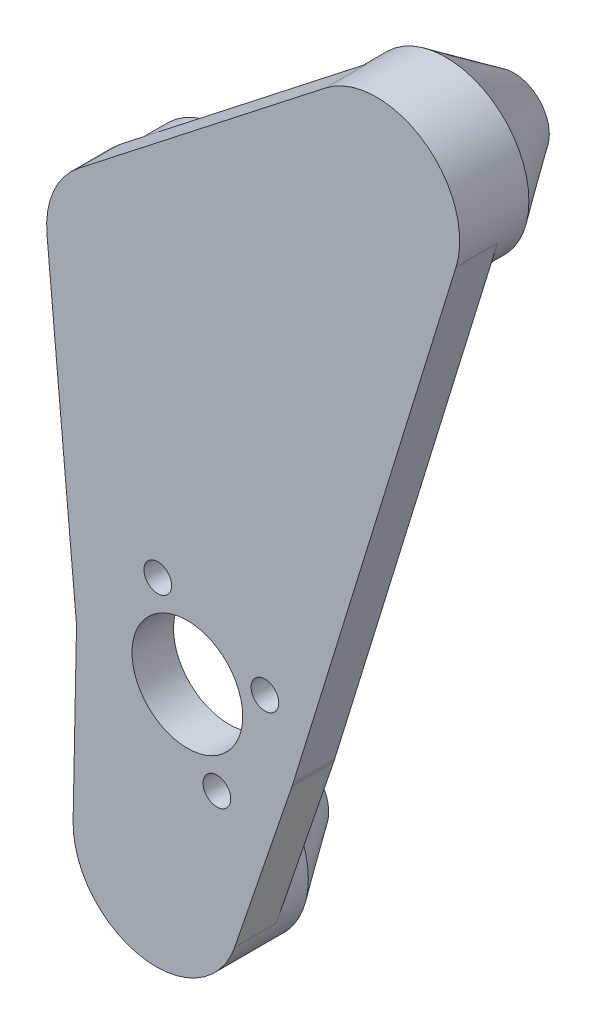
ISO-10303-21;
HEADER;
FILE_DESCRIPTION(('STEP AP214'),'2;1');
FILE_NAME('part.step','',(''),(''),'','','');
FILE_SCHEMA(('AUTOMOTIVE_DESIGN { 1 0 10303 214 1 1 1 1 }'));
ENDSEC;
DATA;
#1=APPLICATION_CONTEXT('core data for automotive mechanical design processes');
#2=APPLICATION_PROTOCOL_DEFINITION('international standard','automotive_design',2000,#1);
#3=PRODUCT_CONTEXT('',#1,'mechanical');
#4=PRODUCT('Part','Part','',(#3));
#5=PRODUCT_RELATED_PRODUCT_CATEGORY('part','',(#4));
#6=PRODUCT_DEFINITION_FORMATION('','',#4);
#7=PRODUCT_DEFINITION_CONTEXT('part definition',#1,'design');
#8=PRODUCT_DEFINITION('design','',#6,#7);
#9=PRODUCT_DEFINITION_SHAPE('','',#8);
#10=(LENGTH_UNIT() NAMED_UNIT(*) SI_UNIT(.MILLI.,.METRE.));
#11=(NAMED_UNIT(*) PLANE_ANGLE_UNIT() SI_UNIT($,.RADIAN.));
#12=(NAMED_UNIT(*) SI_UNIT($,.STERADIAN.) SOLID_ANGLE_UNIT());
#13=UNCERTAINTY_MEASURE_WITH_UNIT(LENGTH_MEASURE(1.E-05),#10,'distance_accuracy_value','');
#14=(GEOMETRIC_REPRESENTATION_CONTEXT(3) GLOBAL_UNCERTAINTY_ASSIGNED_CONTEXT((#13)) GLOBAL_UNIT_ASSIGNED_CONTEXT((#10,
#11,#12)) REPRESENTATION_CONTEXT('',''));
#15=CARTESIAN_POINT('',(0.,0.,0.));
#16=DIRECTION('',(0.,0.,1.));
#17=DIRECTION('',(1.,0.,0.));
#18=AXIS2_PLACEMENT_3D('',#15,#16,#17);
#19=CARTESIAN_POINT('',(0.,0.,3.));
#20=DIRECTION('',(0.,0.,-1.));
#21=DIRECTION('',(-1.,0.,0.));
#22=AXIS2_PLACEMENT_3D('',#19,#20,#21);
#23=CYLINDRICAL_SURFACE('',#22,8.);
#24=CARTESIAN_POINT('',(0.,0.,3.));
#25=DIRECTION('',(0.,0.,1.));
#26=DIRECTION('',(1.,0.,0.));
#27=AXIS2_PLACEMENT_3D('',#24,#25,#26);
#28=CIRCLE('',#27,8.);
#29=CARTESIAN_POINT('',(7.5709466322342,-2.58471799077997,3.));
#30=VERTEX_POINT('',#29);
#31=CARTESIAN_POINT('',(7.64494621697795,-2.35686175655565,3.));
#32=VERTEX_POINT('',#31);
#33=EDGE_CURVE('E64',#30,#32,#28,.T.);
#34=ORIENTED_EDGE('',*,*,#33,.F.);
#35=DIRECTION('',(0.,0.,-1.));
#36=VECTOR('',#35,1.);
#37=CARTESIAN_POINT('',(7.57094663223419,-2.58471799077997,3.));
#38=LINE('',#37,#36);
#39=CARTESIAN_POINT('',(7.5709466322342,-2.58471799077997,0.));
#40=VERTEX_POINT('',#39);
#41=EDGE_CURVE('E154',#30,#40,#38,.T.);
#42=ORIENTED_EDGE('',*,*,#41,.T.);
#43=CARTESIAN_POINT('',(0.,0.,0.));
#44=DIRECTION('',(0.,0.,1.));
#45=DIRECTION('',(1.,0.,0.));
#46=AXIS2_PLACEMENT_3D('',#43,#44,#45);
#47=CIRCLE('',#46,8.);
#48=CARTESIAN_POINT('',(7.64494621697795,-2.35686175655565,0.));
#49=VERTEX_POINT('',#48);
#50=EDGE_CURVE('E182',#40,#49,#47,.T.);
#51=ORIENTED_EDGE('',*,*,#50,.T.);
#52=DIRECTION('',(0.,0.,-1.));
#53=VECTOR('',#52,1.);
#54=CARTESIAN_POINT('',(7.64494621697795,-2.35686175655565,3.));
#55=LINE('',#54,#53);
#56=EDGE_CURVE('E191',#32,#49,#55,.T.);
#57=ORIENTED_EDGE('',*,*,#56,.F.);
#58=EDGE_LOOP('',(#34,#42,#51,#57));
#59=FACE_BOUND('',#58,.T.);
#60=ADVANCED_FACE('F43',(#59),#23,.T.);
#61=CARTESIAN_POINT('',(-16.7441464810517,21.4197792413045,3.));
#62=DIRECTION('',(-0.615871141442547,0.787846899554891,0.));
#63=DIRECTION('',(-0.787846899554891,-0.615871141442546,0.));
#64=AXIS2_PLACEMENT_3D('',#61,#62,#63);
#65=PLANE('',#64);
#66=DIRECTION('',(0.787846899554891,0.615871141442546,0.));
#67=VECTOR('',#66,1.);
#68=CARTESIAN_POINT('',(-16.7441464810517,21.4197792413045,0.));
#69=LINE('',#68,#67);
#70=CARTESIAN_POINT('',(-7.86278311266153,28.3624674696224,0.));
#71=VERTEX_POINT('',#70);
#72=CARTESIAN_POINT('',(-5.86278311266153,29.9258959524672,0.));
#73=VERTEX_POINT('',#72);
#74=EDGE_CURVE('E175',#71,#73,#69,.T.);
#75=ORIENTED_EDGE('',*,*,#74,.F.);
#76=DIRECTION('',(0.,0.,-1.));
#77=VECTOR('',#76,1.);
#78=CARTESIAN_POINT('',(-7.86278311266153,28.3624674696224,3.));
#79=LINE('',#78,#77);
#80=CARTESIAN_POINT('',(-7.86278311266153,28.3624674696224,3.));
#81=VERTEX_POINT('',#80);
#82=EDGE_CURVE('E197',#81,#71,#79,.T.);
#83=ORIENTED_EDGE('',*,*,#82,.F.);
#84=DIRECTION('',(0.787846899554891,0.615871141442546,0.));
#85=VECTOR('',#84,1.);
#86=CARTESIAN_POINT('',(-16.7441464810517,21.4197792413045,3.));
#87=LINE('',#86,#85);
#88=CARTESIAN_POINT('',(9.98557888437163,42.3147862287656,3.));
#89=VERTEX_POINT('',#88);
#90=EDGE_CURVE('E159',#81,#89,#87,.T.);
#91=ORIENTED_EDGE('',*,*,#90,.T.);
#92=DIRECTION('',(0.,0.,-1.));
#93=VECTOR('',#92,1.);
#94=CARTESIAN_POINT('',(9.98557888437163,42.3147862287656,3.));
#95=LINE('',#94,#93);
#96=CARTESIAN_POINT('',(9.98557888437163,42.3147862287656,0.));
#97=VERTEX_POINT('',#96);
#98=EDGE_CURVE('E174',#89,#97,#95,.T.);
#99=ORIENTED_EDGE('',*,*,#98,.T.);
#100=EDGE_CURVE('E158',#73,#97,#69,.T.);
#101=ORIENTED_EDGE('',*,*,#100,.F.);
#102=EDGE_LOOP('',(#75,#83,#91,#99,#101));
#103=FACE_BOUND('',#102,.T.);
#104=ADVANCED_FACE('F236',(#103),#65,.T.);
#105=CARTESIAN_POINT('',(-4.16755626400626,23.635386072293,3.));
#106=DIRECTION('',(0.,0.,-1.));
#107=DIRECTION('',(-1.,0.,0.));
#108=AXIS2_PLACEMENT_3D('',#105,#106,#107);
#109=CYLINDRICAL_SURFACE('',#108,6.);
#110=CARTESIAN_POINT('',(-4.16755626400626,23.635386072293,0.));
#111=DIRECTION('',(0.,0.,1.));
#112=DIRECTION('',(1.,0.,0.));
#113=AXIS2_PLACEMENT_3D('',#110,#111,#112);
#114=CIRCLE('',#113,6.);
#115=CARTESIAN_POINT('',(-10.1426742990136,23.0895248557464,0.));
#116=VERTEX_POINT('',#115);
#117=EDGE_CURVE('E178',#71,#116,#114,.T.);
#118=ORIENTED_EDGE('',*,*,#117,.T.);
#119=DIRECTION('',(0.,0.,-1.));
#120=VECTOR('',#119,1.);
#121=CARTESIAN_POINT('',(-10.1426742990136,23.0895248557464,3.));
#122=LINE('',#121,#120);
#123=CARTESIAN_POINT('',(-10.1426742990136,23.0895248557464,3.));
#124=VERTEX_POINT('',#123);
#125=EDGE_CURVE('E194',#124,#116,#122,.T.);
#126=ORIENTED_EDGE('',*,*,#125,.F.);
#127=CARTESIAN_POINT('',(-4.16755626400626,23.635386072293,3.));
#128=DIRECTION('',(0.,0.,1.));
#129=DIRECTION('',(1.,0.,0.));
#130=AXIS2_PLACEMENT_3D('',#127,#128,#129);
#131=CIRCLE('',#130,6.);
#132=EDGE_CURVE('E162',#81,#124,#131,.T.);
#133=ORIENTED_EDGE('',*,*,#132,.F.);
#134=ORIENTED_EDGE('',*,*,#82,.T.);
#135=EDGE_LOOP('',(#118,#126,#133,#134));
#136=FACE_BOUND('',#135,.T.);
#137=ADVANCED_FACE('F243',(#136),#109,.T.);
#138=CARTESIAN_POINT('',(-7.96682404667648,-0.72781495539554,3.));
#139=DIRECTION('',(0.99585300583456,0.0909768694244424,0.));
#140=DIRECTION('',(-0.0909768694244425,0.99585300583456,0.));
#141=AXIS2_PLACEMENT_3D('',#138,#139,#140);
#142=PLANE('',#141);
#143=DIRECTION('',(0.0909768694244425,-0.99585300583456,0.));
#144=VECTOR('',#143,1.);
#145=CARTESIAN_POINT('',(-7.96682404667648,-0.72781495539554,0.));
#146=LINE('',#145,#144);
#147=CARTESIAN_POINT('',(-8.00732360818826,-0.284497765854474,0.));
#148=VERTEX_POINT('',#147);
#149=EDGE_CURVE('E180',#116,#148,#146,.T.);
#150=ORIENTED_EDGE('',*,*,#149,.T.);
#151=DIRECTION('',(0.,0.,1.));
#152=VECTOR('',#151,1.);
#153=CARTESIAN_POINT('',(-8.00732360818826,-0.28449776585446,3.));
#154=LINE('',#153,#152);
#155=CARTESIAN_POINT('',(-8.00732360818826,-0.284497765854474,3.));
#156=VERTEX_POINT('',#155);
#157=EDGE_CURVE('E138',#148,#156,#154,.T.);
#158=ORIENTED_EDGE('',*,*,#157,.T.);
#159=DIRECTION('',(0.0909768694244425,-0.99585300583456,0.));
#160=VECTOR('',#159,1.);
#161=CARTESIAN_POINT('',(-7.96682404667648,-0.72781495539554,3.));
#162=LINE('',#161,#160);
#163=EDGE_CURVE('E165',#124,#156,#162,.T.);
#164=ORIENTED_EDGE('',*,*,#163,.F.);
#165=ORIENTED_EDGE('',*,*,#125,.T.);
#166=EDGE_LOOP('',(#150,#158,#164,#165));
#167=FACE_BOUND('',#166,.T.);
#168=ADVANCED_FACE('F250',(#167),#142,.F.);
#169=CARTESIAN_POINT('',(7.64494621697795,-2.35686175655565,3.));
#170=DIRECTION('',(0.955618277122243,-0.294607719569456,0.));
#171=DIRECTION('',(0.294607719569456,0.955618277122243,0.));
#172=AXIS2_PLACEMENT_3D('',#169,#170,#171);
#173=PLANE('',#172);
#174=DIRECTION('',(-0.294607719569456,-0.955618277122243,0.));
#175=VECTOR('',#174,1.);
#176=CARTESIAN_POINT('',(7.64494621697795,-2.35686175655565,0.));
#177=LINE('',#176,#175);
#178=CARTESIAN_POINT('',(19.4145153957604,35.8200585140195,0.));
#179=VERTEX_POINT('',#178);
#180=EDGE_CURVE('E163',#179,#49,#177,.T.);
#181=ORIENTED_EDGE('',*,*,#180,.F.);
#182=DIRECTION('',(0.,0.,-1.));
#183=VECTOR('',#182,1.);
#184=CARTESIAN_POINT('',(19.4145153957604,35.8200585140195,3.));
#185=LINE('',#184,#183);
#186=CARTESIAN_POINT('',(19.4145153957604,35.8200585140195,3.));
#187=VERTEX_POINT('',#186);
#188=EDGE_CURVE('E188',#187,#179,#185,.T.);
#189=ORIENTED_EDGE('',*,*,#188,.F.);
#190=DIRECTION('',(-0.294607719569456,-0.955618277122243,0.));
#191=VECTOR('',#190,1.);
#192=CARTESIAN_POINT('',(7.64494621697795,-2.35686175655565,3.));
#193=LINE('',#192,#191);
#194=EDGE_CURVE('E169',#187,#32,#193,.T.);
#195=ORIENTED_EDGE('',*,*,#194,.T.);
#196=ORIENTED_EDGE('',*,*,#56,.T.);
#197=EDGE_LOOP('',(#181,#189,#195,#196));
#198=FACE_BOUND('',#197,.T.);
#199=ADVANCED_FACE('F248',(#198),#173,.T.);
#200=CARTESIAN_POINT('',(13.6808057330269,37.5877048314363,3.));
#201=DIRECTION('',(0.,0.,-1.));
#202=DIRECTION('',(-1.,0.,0.));
#203=AXIS2_PLACEMENT_3D('',#200,#201,#202);
#204=CYLINDRICAL_SURFACE('',#203,6.);
#205=CARTESIAN_POINT('',(13.6808057330269,37.5877048314363,-1.99999999999998));
#206=DIRECTION('',(0.,0.,1.));
#207=DIRECTION('',(1.,0.,0.));
#208=AXIS2_PLACEMENT_3D('',#205,#206,#207);
#209=CIRCLE('',#208,6.);
#210=CARTESIAN_POINT('',(19.6808057330269,37.5877048314363,-1.99999999999998));
#211=VERTEX_POINT('',#210);
#212=EDGE_CURVE('E52',#211,#211,#209,.T.);
#213=ORIENTED_EDGE('',*,*,#212,.T.);
#214=EDGE_LOOP('',(#213));
#215=FACE_BOUND('',#214,.T.);
#216=ORIENTED_EDGE('',*,*,#188,.T.);
#217=CARTESIAN_POINT('',(13.6808057330269,37.5877048314363,0.));
#218=DIRECTION('',(0.,0.,1.));
#219=DIRECTION('',(1.,0.,0.));
#220=AXIS2_PLACEMENT_3D('',#217,#218,#219);
#221=CIRCLE('',#220,6.);
#222=EDGE_CURVE('E328',#97,#179,#221,.T.);
#223=ORIENTED_EDGE('',*,*,#222,.F.);
#224=ORIENTED_EDGE('',*,*,#98,.F.);
#225=CARTESIAN_POINT('',(13.6808057330269,37.5877048314363,3.));
#226=DIRECTION('',(0.,0.,1.));
#227=DIRECTION('',(1.,0.,0.));
#228=AXIS2_PLACEMENT_3D('',#225,#226,#227);
#229=CIRCLE('',#228,6.);
#230=EDGE_CURVE('E172',#187,#89,#229,.T.);
#231=ORIENTED_EDGE('',*,*,#230,.F.);
#232=EDGE_LOOP('',(#216,#223,#224,#231));
#233=FACE_BOUND('',#232,.T.);
#234=ADVANCED_FACE('F223',(#215,#233),#204,.T.);
#235=CARTESIAN_POINT('',(0.,0.,3.));
#236=DIRECTION('',(0.,0.,1.));
#237=DIRECTION('',(1.,0.,0.));
#238=AXIS2_PLACEMENT_3D('',#235,#236,#237);
#239=PLANE('',#238);
#240=CARTESIAN_POINT('',(2.13553569833498,-5.60709258717358,3.));
#241=DIRECTION('',(0.,0.,1.));
#242=DIRECTION('',(1.,0.,0.));
#243=AXIS2_PLACEMENT_3D('',#240,#241,#242);
#244=CIRCLE('',#243,1.);
#245=CARTESIAN_POINT('',(3.13553569833498,-5.60709258717358,3.));
#246=VERTEX_POINT('',#245);
#247=EDGE_CURVE('E204',#246,#246,#244,.T.);
#248=ORIENTED_EDGE('',*,*,#247,.F.);
#249=EDGE_LOOP('',(#248));
#250=FACE_BOUND('',#249,.T.);
#251=CARTESIAN_POINT('',(-2.13553569833494,5.6070925871736,3.));
#252=DIRECTION('',(0.,0.,1.));
#253=DIRECTION('',(1.,0.,0.));
#254=AXIS2_PLACEMENT_3D('',#251,#252,#253);
#255=CIRCLE('',#254,1.);
#256=CARTESIAN_POINT('',(-1.13553569833494,5.6070925871736,3.));
#257=VERTEX_POINT('',#256);
#258=EDGE_CURVE('E343',#257,#257,#255,.T.);
#259=ORIENTED_EDGE('',*,*,#258,.F.);
#260=EDGE_LOOP('',(#259));
#261=FACE_BOUND('',#260,.T.);
#262=CARTESIAN_POINT('',(5.60709258717361,2.13553569833492,3.));
#263=DIRECTION('',(0.,0.,1.));
#264=DIRECTION('',(1.,0.,0.));
#265=AXIS2_PLACEMENT_3D('',#262,#263,#264);
#266=CIRCLE('',#265,1.);
#267=CARTESIAN_POINT('',(6.60709258717361,2.13553569833492,3.));
#268=VERTEX_POINT('',#267);
#269=EDGE_CURVE('E331',#268,#268,#266,.T.);
#270=ORIENTED_EDGE('',*,*,#269,.F.);
#271=EDGE_LOOP('',(#270));
#272=FACE_BOUND('',#271,.T.);
#273=CARTESIAN_POINT('',(0.,0.,3.));
#274=DIRECTION('',(0.,0.,1.));
#275=DIRECTION('',(1.,0.,0.));
#276=AXIS2_PLACEMENT_3D('',#273,#274,#275);
#277=CIRCLE('',#276,4.);
#278=CARTESIAN_POINT('',(4.,0.,3.));
#279=VERTEX_POINT('',#278);
#280=EDGE_CURVE('E148',#279,#279,#277,.T.);
#281=ORIENTED_EDGE('',*,*,#280,.F.);
#282=EDGE_LOOP('',(#281));
#283=FACE_BOUND('',#282,.T.);
#284=DIRECTION('',(0.323089748847497,0.946368329029275,0.));
#285=VECTOR('',#284,1.);
#286=CARTESIAN_POINT('',(7.57094663223419,-2.58471799077997,3.));
#287=LINE('',#286,#285);
#288=CARTESIAN_POINT('',(3.42078366450559,-14.7410392822437,3.));
#289=VERTEX_POINT('',#288);
#290=EDGE_CURVE('E151',#289,#30,#287,.T.);
#291=ORIENTED_EDGE('',*,*,#290,.T.);
#292=ORIENTED_EDGE('',*,*,#33,.T.);
#293=ORIENTED_EDGE('',*,*,#194,.F.);
#294=ORIENTED_EDGE('',*,*,#230,.T.);
#295=ORIENTED_EDGE('',*,*,#90,.F.);
#296=ORIENTED_EDGE('',*,*,#132,.T.);
#297=ORIENTED_EDGE('',*,*,#163,.T.);
#298=DIRECTION('',(0.0200719786898944,0.999798537542175,0.));
#299=VECTOR('',#298,1.);
#300=CARTESIAN_POINT('',(-7.9983883003374,0.160575829519156,3.));
#301=LINE('',#300,#299);
#302=CARTESIAN_POINT('',(-8.25621753492311,-12.6820689170193,3.));
#303=VERTEX_POINT('',#302);
#304=EDGE_CURVE('E145',#303,#156,#301,.T.);
#305=ORIENTED_EDGE('',*,*,#304,.F.);
#306=CARTESIAN_POINT('',(-2.25742630967005,-12.8025007891587,3.));
#307=DIRECTION('',(0.,0.,1.));
#308=DIRECTION('',(1.,0.,0.));
#309=AXIS2_PLACEMENT_3D('',#306,#307,#308);
#310=CIRCLE('',#309,6.);
#311=EDGE_CURVE('E134',#303,#289,#310,.T.);
#312=ORIENTED_EDGE('',*,*,#311,.T.);
#313=EDGE_LOOP('',(#291,#292,#293,#294,#295,#296,#297,#305,#312));
#314=FACE_BOUND('',#313,.T.);
#315=ADVANCED_FACE('F312',(#250,#261,#272,#283,#314),#239,.T.);
#316=CARTESIAN_POINT('',(0.,0.,0.));
#317=DIRECTION('',(0.,0.,1.));
#318=DIRECTION('',(1.,0.,0.));
#319=AXIS2_PLACEMENT_3D('',#316,#317,#318);
#320=PLANE('',#319);
#321=CARTESIAN_POINT('',(2.13553569833498,-5.60709258717358,0.));
#322=DIRECTION('',(0.,0.,1.));
#323=DIRECTION('',(1.,0.,0.));
#324=AXIS2_PLACEMENT_3D('',#321,#322,#323);
#325=CIRCLE('',#324,1.);
#326=CARTESIAN_POINT('',(3.13553569833498,-5.60709258717358,0.));
#327=VERTEX_POINT('',#326);
#328=EDGE_CURVE('E207',#327,#327,#325,.T.);
#329=ORIENTED_EDGE('',*,*,#328,.T.);
#330=EDGE_LOOP('',(#329));
#331=FACE_BOUND('',#330,.T.);
#332=CARTESIAN_POINT('',(-2.13553569833494,5.6070925871736,0.));
#333=DIRECTION('',(0.,0.,1.));
#334=DIRECTION('',(1.,0.,0.));
#335=AXIS2_PLACEMENT_3D('',#332,#333,#334);
#336=CIRCLE('',#335,1.);
#337=CARTESIAN_POINT('',(-1.13553569833494,5.6070925871736,0.));
#338=VERTEX_POINT('',#337);
#339=EDGE_CURVE('E203',#338,#338,#336,.T.);
#340=ORIENTED_EDGE('',*,*,#339,.T.);
#341=EDGE_LOOP('',(#340));
#342=FACE_BOUND('',#341,.T.);
#343=CARTESIAN_POINT('',(5.60709258717361,2.13553569833492,0.));
#344=DIRECTION('',(0.,0.,1.));
#345=DIRECTION('',(1.,0.,0.));
#346=AXIS2_PLACEMENT_3D('',#343,#344,#345);
#347=CIRCLE('',#346,1.);
#348=CARTESIAN_POINT('',(6.60709258717361,2.13553569833492,0.));
#349=VERTEX_POINT('',#348);
#350=EDGE_CURVE('E200',#349,#349,#347,.T.);
#351=ORIENTED_EDGE('',*,*,#350,.T.);
#352=EDGE_LOOP('',(#351));
#353=FACE_BOUND('',#352,.T.);
#354=CARTESIAN_POINT('',(0.,0.,0.));
#355=DIRECTION('',(0.,0.,1.));
#356=DIRECTION('',(1.,0.,0.));
#357=AXIS2_PLACEMENT_3D('',#354,#355,#356);
#358=CIRCLE('',#357,4.);
#359=CARTESIAN_POINT('',(4.,0.,0.));
#360=VERTEX_POINT('',#359);
#361=EDGE_CURVE('E143',#360,#360,#358,.T.);
#362=ORIENTED_EDGE('',*,*,#361,.T.);
#363=EDGE_LOOP('',(#362));
#364=FACE_BOUND('',#363,.T.);
#365=DIRECTION('',(0.323089748847497,0.946368329029275,0.));
#366=VECTOR('',#365,1.);
#367=CARTESIAN_POINT('',(7.57094663223419,-2.58471799077997,0.));
#368=LINE('',#367,#366);
#369=CARTESIAN_POINT('',(3.42078366450559,-14.7410392822437,0.));
#370=VERTEX_POINT('',#369);
#371=EDGE_CURVE('E125',#370,#40,#368,.T.);
#372=ORIENTED_EDGE('',*,*,#371,.F.);
#373=CARTESIAN_POINT('',(-2.25742630967005,-12.8025007891587,0.));
#374=DIRECTION('',(0.,0.,1.));
#375=DIRECTION('',(1.,0.,0.));
#376=AXIS2_PLACEMENT_3D('',#373,#374,#375);
#377=CIRCLE('',#376,6.);
#378=CARTESIAN_POINT('',(-8.25621753492311,-12.6820689170193,0.));
#379=VERTEX_POINT('',#378);
#380=EDGE_CURVE('E117',#370,#379,#377,.T.);
#381=ORIENTED_EDGE('',*,*,#380,.T.);
#382=DIRECTION('',(0.0200719786898944,0.999798537542175,0.));
#383=VECTOR('',#382,1.);
#384=CARTESIAN_POINT('',(-7.9983883003374,0.160575829519156,0.));
#385=LINE('',#384,#383);
#386=EDGE_CURVE('E122',#379,#148,#385,.T.);
#387=ORIENTED_EDGE('',*,*,#386,.T.);
#388=ORIENTED_EDGE('',*,*,#149,.F.);
#389=ORIENTED_EDGE('',*,*,#117,.F.);
#390=ORIENTED_EDGE('',*,*,#74,.T.);
#391=CARTESIAN_POINT('',(-2.16755626400626,25.1988145551378,0.));
#392=DIRECTION('',(0.,0.,1.));
#393=DIRECTION('',(1.,0.,0.));
#394=AXIS2_PLACEMENT_3D('',#391,#392,#393);
#395=CIRCLE('',#394,6.);
#396=EDGE_CURVE('E57',#73,#73,#395,.T.);
#397=ORIENTED_EDGE('',*,*,#396,.T.);
#398=ORIENTED_EDGE('',*,*,#100,.T.);
#399=ORIENTED_EDGE('',*,*,#222,.T.);
#400=ORIENTED_EDGE('',*,*,#180,.T.);
#401=ORIENTED_EDGE('',*,*,#50,.F.);
#402=EDGE_LOOP('',(#372,#381,#387,#388,#389,#390,#397,#398,#399,#400,#401));
#403=FACE_BOUND('',#402,.T.);
#404=ADVANCED_FACE('F119',(#331,#342,#353,#364,#403),#320,.F.);
#405=CARTESIAN_POINT('',(-7.9983883003374,0.160575829519156,3.));
#406=DIRECTION('',(-0.999798537542175,0.0200719786898944,0.));
#407=DIRECTION('',(-0.0200719786898944,-0.999798537542175,0.));
#408=AXIS2_PLACEMENT_3D('',#405,#406,#407);
#409=PLANE('',#408);
#410=ORIENTED_EDGE('',*,*,#157,.F.);
#411=ORIENTED_EDGE('',*,*,#386,.F.);
#412=DIRECTION('',(0.,0.,-1.));
#413=VECTOR('',#412,1.);
#414=CARTESIAN_POINT('',(-8.25621753492311,-12.6820689170193,3.));
#415=LINE('',#414,#413);
#416=EDGE_CURVE('E131',#303,#379,#415,.T.);
#417=ORIENTED_EDGE('',*,*,#416,.F.);
#418=ORIENTED_EDGE('',*,*,#304,.T.);
#419=EDGE_LOOP('',(#410,#411,#417,#418));
#420=FACE_BOUND('',#419,.T.);
#421=ADVANCED_FACE('F142',(#420),#409,.T.);
#422=CARTESIAN_POINT('',(-2.25742630967005,-12.8025007891587,3.));
#423=DIRECTION('',(0.,0.,-1.));
#424=DIRECTION('',(-1.,0.,0.));
#425=AXIS2_PLACEMENT_3D('',#422,#423,#424);
#426=CYLINDRICAL_SURFACE('',#425,6.);
#427=CARTESIAN_POINT('',(-2.25742630967005,-12.8025007891587,-1.99999999999998));
#428=DIRECTION('',(0.,0.,1.));
#429=DIRECTION('',(1.,0.,0.));
#430=AXIS2_PLACEMENT_3D('',#427,#428,#429);
#431=CIRCLE('',#430,6.);
#432=CARTESIAN_POINT('',(3.74257369032995,-12.8025007891587,-1.99999999999998));
#433=VERTEX_POINT('',#432);
#434=EDGE_CURVE('E215',#433,#433,#431,.T.);
#435=ORIENTED_EDGE('',*,*,#434,.T.);
#436=EDGE_LOOP('',(#435));
#437=FACE_BOUND('',#436,.T.);
#438=ORIENTED_EDGE('',*,*,#416,.T.);
#439=ORIENTED_EDGE('',*,*,#380,.F.);
#440=DIRECTION('',(0.,0.,-1.));
#441=VECTOR('',#440,1.);
#442=CARTESIAN_POINT('',(3.42078366450559,-14.7410392822437,3.));
#443=LINE('',#442,#441);
#444=EDGE_CURVE('E139',#289,#370,#443,.T.);
#445=ORIENTED_EDGE('',*,*,#444,.F.);
#446=ORIENTED_EDGE('',*,*,#311,.F.);
#447=EDGE_LOOP('',(#438,#439,#445,#446));
#448=FACE_BOUND('',#447,.T.);
#449=ADVANCED_FACE('F132',(#437,#448),#426,.T.);
#450=CARTESIAN_POINT('',(7.57094663223419,-2.58471799077997,3.));
#451=DIRECTION('',(-0.946368329029275,0.323089748847497,0.));
#452=DIRECTION('',(-0.323089748847497,-0.946368329029275,0.));
#453=AXIS2_PLACEMENT_3D('',#450,#451,#452);
#454=PLANE('',#453);
#455=ORIENTED_EDGE('',*,*,#371,.T.);
#456=ORIENTED_EDGE('',*,*,#41,.F.);
#457=ORIENTED_EDGE('',*,*,#290,.F.);
#458=ORIENTED_EDGE('',*,*,#444,.T.);
#459=EDGE_LOOP('',(#455,#456,#457,#458));
#460=FACE_BOUND('',#459,.T.);
#461=ADVANCED_FACE('F303',(#460),#454,.F.);
#462=CARTESIAN_POINT('',(0.,0.,-47.));
#463=DIRECTION('',(0.,0.,1.));
#464=DIRECTION('',(1.,0.,0.));
#465=AXIS2_PLACEMENT_3D('',#462,#463,#464);
#466=CYLINDRICAL_SURFACE('',#465,4.);
#467=ORIENTED_EDGE('',*,*,#280,.T.);
#468=EDGE_LOOP('',(#467));
#469=FACE_BOUND('',#468,.T.);
#470=ORIENTED_EDGE('',*,*,#361,.F.);
#471=EDGE_LOOP('',(#470));
#472=FACE_BOUND('',#471,.T.);
#473=ADVANCED_FACE('F299',(#469,#472),#466,.F.);
#474=CARTESIAN_POINT('',(5.60709258717361,2.13553569833492,-7.));
#475=DIRECTION('',(0.,0.,1.));
#476=DIRECTION('',(1.,0.,0.));
#477=AXIS2_PLACEMENT_3D('',#474,#475,#476);
#478=CYLINDRICAL_SURFACE('',#477,1.);
#479=ORIENTED_EDGE('',*,*,#269,.T.);
#480=EDGE_LOOP('',(#479));
#481=FACE_BOUND('',#480,.T.);
#482=ORIENTED_EDGE('',*,*,#350,.F.);
#483=EDGE_LOOP('',(#482));
#484=FACE_BOUND('',#483,.T.);
#485=ADVANCED_FACE('F295',(#481,#484),#478,.F.);
#486=CARTESIAN_POINT('',(-2.13553569833494,5.6070925871736,-7.));
#487=DIRECTION('',(0.,0.,1.));
#488=DIRECTION('',(1.,0.,0.));
#489=AXIS2_PLACEMENT_3D('',#486,#487,#488);
#490=CYLINDRICAL_SURFACE('',#489,1.);
#491=ORIENTED_EDGE('',*,*,#258,.T.);
#492=EDGE_LOOP('',(#491));
#493=FACE_BOUND('',#492,.T.);
#494=ORIENTED_EDGE('',*,*,#339,.F.);
#495=EDGE_LOOP('',(#494));
#496=FACE_BOUND('',#495,.T.);
#497=ADVANCED_FACE('F288',(#493,#496),#490,.F.);
#498=CARTESIAN_POINT('',(2.13553569833498,-5.60709258717358,-7.));
#499=DIRECTION('',(0.,0.,1.));
#500=DIRECTION('',(1.,0.,0.));
#501=AXIS2_PLACEMENT_3D('',#498,#499,#500);
#502=CYLINDRICAL_SURFACE('',#501,1.);
#503=ORIENTED_EDGE('',*,*,#247,.T.);
#504=EDGE_LOOP('',(#503));
#505=FACE_BOUND('',#504,.T.);
#506=ORIENTED_EDGE('',*,*,#328,.F.);
#507=EDGE_LOOP('',(#506));
#508=FACE_BOUND('',#507,.T.);
#509=ADVANCED_FACE('F279',(#505,#508),#502,.F.);
#510=CARTESIAN_POINT('',(-2.16755626400626,25.1988145551378,-7.));
#511=DIRECTION('',(0.,0.,1.));
#512=DIRECTION('',(1.,0.,0.));
#513=AXIS2_PLACEMENT_3D('',#510,#511,#512);
#514=CYLINDRICAL_SURFACE('',#513,6.);
#515=CARTESIAN_POINT('',(-2.16755626400626,25.1988145551378,-1.99999999999998));
#516=DIRECTION('',(0.,0.,1.));
#517=DIRECTION('',(1.,0.,0.));
#518=AXIS2_PLACEMENT_3D('',#515,#516,#517);
#519=CIRCLE('',#518,6.);
#520=CARTESIAN_POINT('',(3.83244373599374,25.1988145551378,-1.99999999999998));
#521=VERTEX_POINT('',#520);
#522=EDGE_CURVE('E198',#521,#521,#519,.T.);
#523=ORIENTED_EDGE('',*,*,#522,.T.);
#524=EDGE_LOOP('',(#523));
#525=FACE_BOUND('',#524,.T.);
#526=ORIENTED_EDGE('',*,*,#396,.F.);
#527=EDGE_LOOP('',(#526));
#528=FACE_BOUND('',#527,.T.);
#529=ADVANCED_FACE('F276',(#525,#528),#514,.T.);
#530=CARTESIAN_POINT('',(13.6808057330269,37.5877048314363,-10.));
#531=DIRECTION('',(0.,1.,0.));
#532=DIRECTION('',(0.,0.,-1.));
#533=AXIS2_PLACEMENT_3D('',#530,#531,#532);
#534=SPHERICAL_SURFACE('',#533,3.99999999999999);
#535=CARTESIAN_POINT('',(13.6808057330269,37.5877048314363,-10.));
#536=DIRECTION('',(0.,0.,1.));
#537=DIRECTION('',(1.,0.,0.));
#538=AXIS2_PLACEMENT_3D('',#535,#536,#537);
#539=SPHERICAL_SURFACE('',#538,3.99999999999999);
#540=CARTESIAN_POINT('',(13.6808057330269,37.5877048314363,-6.92147057076465));
#541=DIRECTION('',(0.,0.,1.));
#542=DIRECTION('',(1.,0.,0.));
#543=AXIS2_PLACEMENT_3D('',#540,#541,#542);
#544=CIRCLE('',#543,2.55394920727328);
#545=CARTESIAN_POINT('',(16.2347549403002,37.5877048314363,-6.92147057076465));
#546=VERTEX_POINT('',#545);
#547=EDGE_CURVE('E11',#546,#546,#544,.F.);
#548=ORIENTED_EDGE('',*,*,#547,.T.);
#549=EDGE_LOOP('',(#548));
#550=FACE_BOUND('',#549,.T.);
#551=ADVANCED_FACE('F278',(#550),#539,.F.);
#552=CARTESIAN_POINT('',(-2.16755626400626,25.1988145551378,-10.));
#553=DIRECTION('',(0.,1.,0.));
#554=DIRECTION('',(0.,0.,-1.));
#555=AXIS2_PLACEMENT_3D('',#552,#553,#554);
#556=SPHERICAL_SURFACE('',#555,4.);
#557=CARTESIAN_POINT('',(-2.16755626400626,25.1988145551378,-10.));
#558=DIRECTION('',(0.,0.,1.));
#559=DIRECTION('',(1.,0.,0.));
#560=AXIS2_PLACEMENT_3D('',#557,#558,#559);
#561=SPHERICAL_SURFACE('',#560,4.);
#562=CARTESIAN_POINT('',(-2.16755626400626,25.1988145551378,-6.92147057076465));
#563=DIRECTION('',(0.,0.,1.));
#564=DIRECTION('',(1.,0.,0.));
#565=AXIS2_PLACEMENT_3D('',#562,#563,#564);
#566=CIRCLE('',#565,2.55394920727329);
#567=CARTESIAN_POINT('',(0.386392943267028,25.1988145551378,-6.92147057076465));
#568=VERTEX_POINT('',#567);
#569=EDGE_CURVE('E212',#568,#568,#566,.F.);
#570=ORIENTED_EDGE('',*,*,#569,.T.);
#571=EDGE_LOOP('',(#570));
#572=FACE_BOUND('',#571,.T.);
#573=ADVANCED_FACE('F269',(#572),#561,.F.);
#574=CARTESIAN_POINT('',(-2.25742630967005,-12.8025007891587,-10.));
#575=DIRECTION('',(0.,1.,0.));
#576=DIRECTION('',(0.,0.,-1.));
#577=AXIS2_PLACEMENT_3D('',#574,#575,#576);
#578=SPHERICAL_SURFACE('',#577,4.);
#579=CARTESIAN_POINT('',(-2.25742630967005,-12.8025007891587,-10.));
#580=DIRECTION('',(0.,0.,1.));
#581=DIRECTION('',(1.,0.,0.));
#582=AXIS2_PLACEMENT_3D('',#579,#580,#581);
#583=SPHERICAL_SURFACE('',#582,4.);
#584=CARTESIAN_POINT('',(-2.25742630967005,-12.8025007891587,-6.92147057076465));
#585=DIRECTION('',(0.,0.,1.));
#586=DIRECTION('',(1.,0.,0.));
#587=AXIS2_PLACEMENT_3D('',#584,#585,#586);
#588=CIRCLE('',#587,2.55394920727329);
#589=CARTESIAN_POINT('',(0.296522897603234,-12.8025007891587,-6.92147057076465));
#590=VERTEX_POINT('',#589);
#591=EDGE_CURVE('E218',#590,#590,#588,.F.);
#592=ORIENTED_EDGE('',*,*,#591,.T.);
#593=EDGE_LOOP('',(#592));
#594=FACE_BOUND('',#593,.T.);
#595=ADVANCED_FACE('F260',(#594),#583,.F.);
#596=CARTESIAN_POINT('',(-2.16755626400626,25.1988145551378,-1.99999999999998));
#597=DIRECTION('',(0.,0.,1.));
#598=DIRECTION('',(1.,0.,0.));
#599=AXIS2_PLACEMENT_3D('',#596,#597,#598);
#600=CONICAL_SURFACE('',#599,6.,0.610865238198022);
#601=ORIENTED_EDGE('',*,*,#569,.F.);
#602=EDGE_LOOP('',(#601));
#603=FACE_BOUND('',#602,.T.);
#604=ORIENTED_EDGE('',*,*,#522,.F.);
#605=EDGE_LOOP('',(#604));
#606=FACE_BOUND('',#605,.T.);
#607=ADVANCED_FACE('F232',(#603,#606),#600,.T.);
#608=CARTESIAN_POINT('',(-2.25742630967005,-12.8025007891587,-1.99999999999998));
#609=DIRECTION('',(0.,0.,1.));
#610=DIRECTION('',(1.,0.,0.));
#611=AXIS2_PLACEMENT_3D('',#608,#609,#610);
#612=CONICAL_SURFACE('',#611,6.,0.610865238198022);
#613=ORIENTED_EDGE('',*,*,#591,.F.);
#614=EDGE_LOOP('',(#613));
#615=FACE_BOUND('',#614,.T.);
#616=ORIENTED_EDGE('',*,*,#434,.F.);
#617=EDGE_LOOP('',(#616));
#618=FACE_BOUND('',#617,.T.);
#619=ADVANCED_FACE('F227',(#615,#618),#612,.T.);
#620=CARTESIAN_POINT('',(13.6808057330269,37.5877048314363,-1.99999999999998));
#621=DIRECTION('',(0.,0.,1.));
#622=DIRECTION('',(1.,0.,0.));
#623=AXIS2_PLACEMENT_3D('',#620,#621,#622);
#624=CONICAL_SURFACE('',#623,6.,0.610865238198022);
#625=ORIENTED_EDGE('',*,*,#547,.F.);
#626=EDGE_LOOP('',(#625));
#627=FACE_BOUND('',#626,.T.);
#628=ORIENTED_EDGE('',*,*,#212,.F.);
#629=EDGE_LOOP('',(#628));
#630=FACE_BOUND('',#629,.T.);
#631=ADVANCED_FACE('F46',(#627,#630),#624,.T.);
#632=CLOSED_SHELL('',(#60,#104,#137,#168,#199,#234,#315,#404,#421,#449,#461,#473,#485,#497,#509,
#529,#551,#573,#595,#607,#619,#631));
#633=MANIFOLD_SOLID_BREP('B2',#632);
#634=ADVANCED_BREP_SHAPE_REPRESENTATION('',(#18,#633),#14);
#635=SHAPE_DEFINITION_REPRESENTATION(#9,#634);
ENDSEC;
END-ISO-10303-21;
